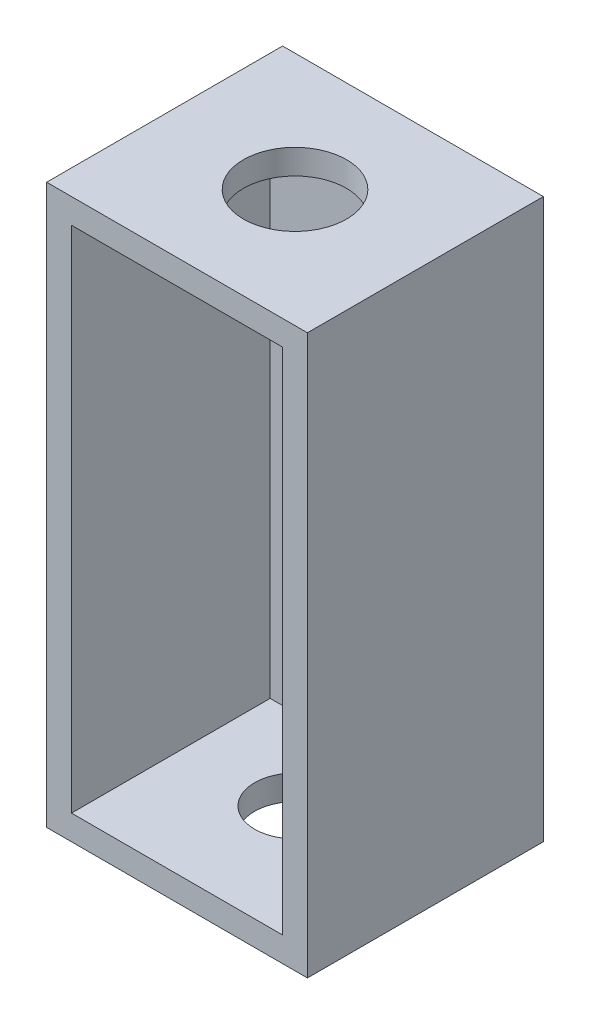
ISO-10303-21;
HEADER;
FILE_DESCRIPTION(('STEP AP214'),'2;1');
FILE_NAME('part.step','',(''),(''),'','','');
FILE_SCHEMA(('AUTOMOTIVE_DESIGN { 1 0 10303 214 1 1 1 1 }'));
ENDSEC;
DATA;
#1=APPLICATION_CONTEXT('core data for automotive mechanical design processes');
#2=APPLICATION_PROTOCOL_DEFINITION('international standard','automotive_design',2000,#1);
#3=PRODUCT_CONTEXT('',#1,'mechanical');
#4=PRODUCT('Part','Part','',(#3));
#5=PRODUCT_RELATED_PRODUCT_CATEGORY('part','',(#4));
#6=PRODUCT_DEFINITION_FORMATION('','',#4);
#7=PRODUCT_DEFINITION_CONTEXT('part definition',#1,'design');
#8=PRODUCT_DEFINITION('design','',#6,#7);
#9=PRODUCT_DEFINITION_SHAPE('','',#8);
#10=(LENGTH_UNIT() NAMED_UNIT(*) SI_UNIT(.MILLI.,.METRE.));
#11=(NAMED_UNIT(*) PLANE_ANGLE_UNIT() SI_UNIT($,.RADIAN.));
#12=(NAMED_UNIT(*) SI_UNIT($,.STERADIAN.) SOLID_ANGLE_UNIT());
#13=UNCERTAINTY_MEASURE_WITH_UNIT(LENGTH_MEASURE(1.E-05),#10,'distance_accuracy_value','');
#14=(GEOMETRIC_REPRESENTATION_CONTEXT(3) GLOBAL_UNCERTAINTY_ASSIGNED_CONTEXT((#13)) GLOBAL_UNIT_ASSIGNED_CONTEXT((#10,
#11,#12)) REPRESENTATION_CONTEXT('',''));
#15=CARTESIAN_POINT('',(0.,0.,0.));
#16=DIRECTION('',(0.,0.,1.));
#17=DIRECTION('',(1.,0.,0.));
#18=AXIS2_PLACEMENT_3D('',#15,#16,#17);
#19=CARTESIAN_POINT('',(0.,90.,38.));
#20=DIRECTION('',(1.,0.,0.));
#21=DIRECTION('',(0.,0.,-1.));
#22=AXIS2_PLACEMENT_3D('',#19,#20,#21);
#23=PLANE('',#22);
#24=DIRECTION('',(0.,-1.,0.));
#25=VECTOR('',#24,1.);
#26=CARTESIAN_POINT('',(0.,90.,0.));
#27=LINE('',#26,#25);
#28=CARTESIAN_POINT('',(0.,90.,0.));
#29=VERTEX_POINT('',#28);
#30=CARTESIAN_POINT('',(0.,0.,0.));
#31=VERTEX_POINT('',#30);
#32=EDGE_CURVE('E153',#29,#31,#27,.T.);
#33=ORIENTED_EDGE('',*,*,#32,.T.);
#34=DIRECTION('',(0.,0.,-1.));
#35=VECTOR('',#34,1.);
#36=CARTESIAN_POINT('',(0.,0.,38.));
#37=LINE('',#36,#35);
#38=CARTESIAN_POINT('',(0.,0.,38.));
#39=VERTEX_POINT('',#38);
#40=EDGE_CURVE('E11',#39,#31,#37,.T.);
#41=ORIENTED_EDGE('',*,*,#40,.F.);
#42=DIRECTION('',(0.,-1.,0.));
#43=VECTOR('',#42,1.);
#44=CARTESIAN_POINT('',(0.,90.,38.));
#45=LINE('',#44,#43);
#46=CARTESIAN_POINT('',(0.,90.,38.));
#47=VERTEX_POINT('',#46);
#48=EDGE_CURVE('E157',#47,#39,#45,.T.);
#49=ORIENTED_EDGE('',*,*,#48,.F.);
#50=DIRECTION('',(0.,0.,-1.));
#51=VECTOR('',#50,1.);
#52=CARTESIAN_POINT('',(0.,90.,38.));
#53=LINE('',#52,#51);
#54=EDGE_CURVE('E163',#47,#29,#53,.T.);
#55=ORIENTED_EDGE('',*,*,#54,.T.);
#56=EDGE_LOOP('',(#33,#41,#49,#55));
#57=FACE_BOUND('',#56,.T.);
#58=ADVANCED_FACE('F39',(#57),#23,.F.);
#59=CARTESIAN_POINT('',(0.,0.,38.));
#60=DIRECTION('',(0.,1.,0.));
#61=DIRECTION('',(0.,0.,1.));
#62=AXIS2_PLACEMENT_3D('',#59,#60,#61);
#63=PLANE('',#62);
#64=CARTESIAN_POINT('',(21.,0.,19.));
#65=DIRECTION('',(0.,1.,0.));
#66=DIRECTION('',(0.,0.,1.));
#67=AXIS2_PLACEMENT_3D('',#64,#65,#66);
#68=CIRCLE('',#67,6.5);
#69=CARTESIAN_POINT('',(21.,0.,25.5));
#70=VERTEX_POINT('',#69);
#71=EDGE_CURVE('E140',#70,#70,#68,.T.);
#72=ORIENTED_EDGE('',*,*,#71,.T.);
#73=EDGE_LOOP('',(#72));
#74=FACE_BOUND('',#73,.T.);
#75=DIRECTION('',(1.,0.,0.));
#76=VECTOR('',#75,1.);
#77=CARTESIAN_POINT('',(0.,0.,0.));
#78=LINE('',#77,#76);
#79=CARTESIAN_POINT('',(42.,0.,0.));
#80=VERTEX_POINT('',#79);
#81=EDGE_CURVE('E166',#31,#80,#78,.T.);
#82=ORIENTED_EDGE('',*,*,#81,.T.);
#83=DIRECTION('',(0.,0.,-1.));
#84=VECTOR('',#83,1.);
#85=CARTESIAN_POINT('',(42.,0.,38.));
#86=LINE('',#85,#84);
#87=CARTESIAN_POINT('',(42.,0.,38.));
#88=VERTEX_POINT('',#87);
#89=EDGE_CURVE('E47',#88,#80,#86,.T.);
#90=ORIENTED_EDGE('',*,*,#89,.F.);
#91=DIRECTION('',(1.,0.,0.));
#92=VECTOR('',#91,1.);
#93=CARTESIAN_POINT('',(0.,0.,38.));
#94=LINE('',#93,#92);
#95=EDGE_CURVE('E92',#39,#88,#94,.T.);
#96=ORIENTED_EDGE('',*,*,#95,.F.);
#97=ORIENTED_EDGE('',*,*,#40,.T.);
#98=EDGE_LOOP('',(#82,#90,#96,#97));
#99=FACE_BOUND('',#98,.T.);
#100=ADVANCED_FACE('F203',(#74,#99),#63,.F.);
#101=CARTESIAN_POINT('',(42.,0.,38.));
#102=DIRECTION('',(-1.,0.,0.));
#103=DIRECTION('',(0.,0.,1.));
#104=AXIS2_PLACEMENT_3D('',#101,#102,#103);
#105=PLANE('',#104);
#106=DIRECTION('',(0.,1.,0.));
#107=VECTOR('',#106,1.);
#108=CARTESIAN_POINT('',(42.,0.,0.));
#109=LINE('',#108,#107);
#110=CARTESIAN_POINT('',(42.,90.,0.));
#111=VERTEX_POINT('',#110);
#112=EDGE_CURVE('E168',#80,#111,#109,.T.);
#113=ORIENTED_EDGE('',*,*,#112,.T.);
#114=DIRECTION('',(0.,0.,-1.));
#115=VECTOR('',#114,1.);
#116=CARTESIAN_POINT('',(42.,90.,38.));
#117=LINE('',#116,#115);
#118=CARTESIAN_POINT('',(42.,90.,38.));
#119=VERTEX_POINT('',#118);
#120=EDGE_CURVE('E172',#119,#111,#117,.T.);
#121=ORIENTED_EDGE('',*,*,#120,.F.);
#122=DIRECTION('',(0.,1.,0.));
#123=VECTOR('',#122,1.);
#124=CARTESIAN_POINT('',(42.,0.,38.));
#125=LINE('',#124,#123);
#126=EDGE_CURVE('E160',#88,#119,#125,.T.);
#127=ORIENTED_EDGE('',*,*,#126,.F.);
#128=ORIENTED_EDGE('',*,*,#89,.T.);
#129=EDGE_LOOP('',(#113,#121,#127,#128));
#130=FACE_BOUND('',#129,.T.);
#131=ADVANCED_FACE('F194',(#130),#105,.F.);
#132=CARTESIAN_POINT('',(42.,90.,38.));
#133=DIRECTION('',(0.,-1.,0.));
#134=DIRECTION('',(0.,0.,-1.));
#135=AXIS2_PLACEMENT_3D('',#132,#133,#134);
#136=PLANE('',#135);
#137=CARTESIAN_POINT('',(21.,90.,19.));
#138=DIRECTION('',(0.,1.,0.));
#139=DIRECTION('',(0.,0.,1.));
#140=AXIS2_PLACEMENT_3D('',#137,#138,#139);
#141=CIRCLE('',#140,8.3);
#142=CARTESIAN_POINT('',(21.,90.,27.3));
#143=VERTEX_POINT('',#142);
#144=EDGE_CURVE('E182',#143,#143,#141,.T.);
#145=ORIENTED_EDGE('',*,*,#144,.F.);
#146=EDGE_LOOP('',(#145));
#147=FACE_BOUND('',#146,.T.);
#148=DIRECTION('',(-1.,0.,0.));
#149=VECTOR('',#148,1.);
#150=CARTESIAN_POINT('',(42.,90.,0.));
#151=LINE('',#150,#149);
#152=EDGE_CURVE('E85',#111,#29,#151,.T.);
#153=ORIENTED_EDGE('',*,*,#152,.T.);
#154=ORIENTED_EDGE('',*,*,#54,.F.);
#155=DIRECTION('',(-1.,0.,0.));
#156=VECTOR('',#155,1.);
#157=CARTESIAN_POINT('',(42.,90.,38.));
#158=LINE('',#157,#156);
#159=EDGE_CURVE('E64',#119,#47,#158,.T.);
#160=ORIENTED_EDGE('',*,*,#159,.F.);
#161=ORIENTED_EDGE('',*,*,#120,.T.);
#162=EDGE_LOOP('',(#153,#154,#160,#161));
#163=FACE_BOUND('',#162,.T.);
#164=ADVANCED_FACE('F191',(#147,#163),#136,.F.);
#165=CARTESIAN_POINT('',(0.,0.,38.));
#166=DIRECTION('',(0.,0.,1.));
#167=DIRECTION('',(1.,0.,0.));
#168=AXIS2_PLACEMENT_3D('',#165,#166,#167);
#169=PLANE('',#168);
#170=DIRECTION('',(0.,-1.,0.));
#171=VECTOR('',#170,1.);
#172=CARTESIAN_POINT('',(4.,86.,38.));
#173=LINE('',#172,#171);
#174=CARTESIAN_POINT('',(4.,86.,38.));
#175=VERTEX_POINT('',#174);
#176=CARTESIAN_POINT('',(4.,4.,38.));
#177=VERTEX_POINT('',#176);
#178=EDGE_CURVE('E55',#175,#177,#173,.T.);
#179=ORIENTED_EDGE('',*,*,#178,.F.);
#180=DIRECTION('',(-1.,0.,0.));
#181=VECTOR('',#180,1.);
#182=CARTESIAN_POINT('',(38.,86.,38.));
#183=LINE('',#182,#181);
#184=CARTESIAN_POINT('',(38.,86.,38.));
#185=VERTEX_POINT('',#184);
#186=EDGE_CURVE('E134',#185,#175,#183,.T.);
#187=ORIENTED_EDGE('',*,*,#186,.F.);
#188=DIRECTION('',(0.,1.,0.));
#189=VECTOR('',#188,1.);
#190=CARTESIAN_POINT('',(38.,4.,38.));
#191=LINE('',#190,#189);
#192=CARTESIAN_POINT('',(38.,4.,38.));
#193=VERTEX_POINT('',#192);
#194=EDGE_CURVE('E137',#193,#185,#191,.T.);
#195=ORIENTED_EDGE('',*,*,#194,.F.);
#196=DIRECTION('',(1.,0.,0.));
#197=VECTOR('',#196,1.);
#198=CARTESIAN_POINT('',(4.,4.,38.));
#199=LINE('',#198,#197);
#200=EDGE_CURVE('E146',#177,#193,#199,.T.);
#201=ORIENTED_EDGE('',*,*,#200,.F.);
#202=EDGE_LOOP('',(#179,#187,#195,#201));
#203=FACE_BOUND('',#202,.T.);
#204=ORIENTED_EDGE('',*,*,#48,.T.);
#205=ORIENTED_EDGE('',*,*,#95,.T.);
#206=ORIENTED_EDGE('',*,*,#126,.T.);
#207=ORIENTED_EDGE('',*,*,#159,.T.);
#208=EDGE_LOOP('',(#204,#205,#206,#207));
#209=FACE_BOUND('',#208,.T.);
#210=ADVANCED_FACE('F193',(#203,#209),#169,.T.);
#211=CARTESIAN_POINT('',(0.,0.,0.));
#212=DIRECTION('',(0.,0.,1.));
#213=DIRECTION('',(1.,0.,0.));
#214=AXIS2_PLACEMENT_3D('',#211,#212,#213);
#215=PLANE('',#214);
#216=ORIENTED_EDGE('',*,*,#32,.F.);
#217=ORIENTED_EDGE('',*,*,#152,.F.);
#218=ORIENTED_EDGE('',*,*,#112,.F.);
#219=ORIENTED_EDGE('',*,*,#81,.F.);
#220=EDGE_LOOP('',(#216,#217,#218,#219));
#221=FACE_BOUND('',#220,.T.);
#222=ADVANCED_FACE('F200',(#221),#215,.F.);
#223=CARTESIAN_POINT('',(4.,86.,6.));
#224=DIRECTION('',(-1.,0.,0.));
#225=DIRECTION('',(0.,0.,1.));
#226=AXIS2_PLACEMENT_3D('',#223,#224,#225);
#227=PLANE('',#226);
#228=ORIENTED_EDGE('',*,*,#178,.T.);
#229=DIRECTION('',(0.,0.,1.));
#230=VECTOR('',#229,1.);
#231=CARTESIAN_POINT('',(4.,4.,6.));
#232=LINE('',#231,#230);
#233=CARTESIAN_POINT('',(4.,4.,6.));
#234=VERTEX_POINT('',#233);
#235=EDGE_CURVE('E112',#234,#177,#232,.T.);
#236=ORIENTED_EDGE('',*,*,#235,.F.);
#237=DIRECTION('',(0.,-1.,0.));
#238=VECTOR('',#237,1.);
#239=CARTESIAN_POINT('',(4.,86.,6.));
#240=LINE('',#239,#238);
#241=CARTESIAN_POINT('',(4.,86.,6.));
#242=VERTEX_POINT('',#241);
#243=EDGE_CURVE('E116',#242,#234,#240,.T.);
#244=ORIENTED_EDGE('',*,*,#243,.F.);
#245=DIRECTION('',(0.,0.,1.));
#246=VECTOR('',#245,1.);
#247=CARTESIAN_POINT('',(4.,86.,6.));
#248=LINE('',#247,#246);
#249=EDGE_CURVE('E151',#242,#175,#248,.T.);
#250=ORIENTED_EDGE('',*,*,#249,.T.);
#251=EDGE_LOOP('',(#228,#236,#244,#250));
#252=FACE_BOUND('',#251,.T.);
#253=ADVANCED_FACE('F114',(#252),#227,.F.);
#254=CARTESIAN_POINT('',(38.,86.,6.));
#255=DIRECTION('',(0.,1.,0.));
#256=DIRECTION('',(0.,0.,1.));
#257=AXIS2_PLACEMENT_3D('',#254,#255,#256);
#258=PLANE('',#257);
#259=CARTESIAN_POINT('',(21.,86.,19.));
#260=DIRECTION('',(0.,1.,0.));
#261=DIRECTION('',(0.,0.,1.));
#262=AXIS2_PLACEMENT_3D('',#259,#260,#261);
#263=CIRCLE('',#262,8.3);
#264=CARTESIAN_POINT('',(21.,86.,27.3));
#265=VERTEX_POINT('',#264);
#266=EDGE_CURVE('E42',#265,#265,#263,.T.);
#267=ORIENTED_EDGE('',*,*,#266,.T.);
#268=EDGE_LOOP('',(#267));
#269=FACE_BOUND('',#268,.T.);
#270=ORIENTED_EDGE('',*,*,#186,.T.);
#271=ORIENTED_EDGE('',*,*,#249,.F.);
#272=DIRECTION('',(-1.,0.,0.));
#273=VECTOR('',#272,1.);
#274=CARTESIAN_POINT('',(38.,86.,6.));
#275=LINE('',#274,#273);
#276=CARTESIAN_POINT('',(38.,86.,6.));
#277=VERTEX_POINT('',#276);
#278=EDGE_CURVE('E122',#277,#242,#275,.T.);
#279=ORIENTED_EDGE('',*,*,#278,.F.);
#280=DIRECTION('',(0.,0.,1.));
#281=VECTOR('',#280,1.);
#282=CARTESIAN_POINT('',(38.,86.,6.));
#283=LINE('',#282,#281);
#284=EDGE_CURVE('E154',#277,#185,#283,.T.);
#285=ORIENTED_EDGE('',*,*,#284,.T.);
#286=EDGE_LOOP('',(#270,#271,#279,#285));
#287=FACE_BOUND('',#286,.T.);
#288=ADVANCED_FACE('F223',(#269,#287),#258,.F.);
#289=CARTESIAN_POINT('',(38.,4.,6.));
#290=DIRECTION('',(1.,0.,0.));
#291=DIRECTION('',(0.,0.,-1.));
#292=AXIS2_PLACEMENT_3D('',#289,#290,#291);
#293=PLANE('',#292);
#294=ORIENTED_EDGE('',*,*,#194,.T.);
#295=ORIENTED_EDGE('',*,*,#284,.F.);
#296=DIRECTION('',(0.,1.,0.));
#297=VECTOR('',#296,1.);
#298=CARTESIAN_POINT('',(38.,4.,6.));
#299=LINE('',#298,#297);
#300=CARTESIAN_POINT('',(38.,4.,6.));
#301=VERTEX_POINT('',#300);
#302=EDGE_CURVE('E130',#301,#277,#299,.T.);
#303=ORIENTED_EDGE('',*,*,#302,.F.);
#304=DIRECTION('',(0.,0.,1.));
#305=VECTOR('',#304,1.);
#306=CARTESIAN_POINT('',(38.,4.,6.));
#307=LINE('',#306,#305);
#308=EDGE_CURVE('E121',#301,#193,#307,.T.);
#309=ORIENTED_EDGE('',*,*,#308,.T.);
#310=EDGE_LOOP('',(#294,#295,#303,#309));
#311=FACE_BOUND('',#310,.T.);
#312=ADVANCED_FACE('F228',(#311),#293,.F.);
#313=CARTESIAN_POINT('',(4.,4.,6.));
#314=DIRECTION('',(0.,-1.,0.));
#315=DIRECTION('',(0.,0.,-1.));
#316=AXIS2_PLACEMENT_3D('',#313,#314,#315);
#317=PLANE('',#316);
#318=CARTESIAN_POINT('',(21.,4.,19.));
#319=DIRECTION('',(0.,-1.,0.));
#320=DIRECTION('',(0.,0.,-1.));
#321=AXIS2_PLACEMENT_3D('',#318,#319,#320);
#322=CIRCLE('',#321,6.5);
#323=CARTESIAN_POINT('',(21.,4.,25.5));
#324=VERTEX_POINT('',#323);
#325=EDGE_CURVE('E147',#324,#324,#322,.T.);
#326=ORIENTED_EDGE('',*,*,#325,.T.);
#327=EDGE_LOOP('',(#326));
#328=FACE_BOUND('',#327,.T.);
#329=ORIENTED_EDGE('',*,*,#200,.T.);
#330=ORIENTED_EDGE('',*,*,#308,.F.);
#331=DIRECTION('',(1.,0.,0.));
#332=VECTOR('',#331,1.);
#333=CARTESIAN_POINT('',(4.,4.,6.));
#334=LINE('',#333,#332);
#335=EDGE_CURVE('E125',#234,#301,#334,.T.);
#336=ORIENTED_EDGE('',*,*,#335,.F.);
#337=ORIENTED_EDGE('',*,*,#235,.T.);
#338=EDGE_LOOP('',(#329,#330,#336,#337));
#339=FACE_BOUND('',#338,.T.);
#340=ADVANCED_FACE('F126',(#328,#339),#317,.F.);
#341=CARTESIAN_POINT('',(0.,0.,6.));
#342=DIRECTION('',(0.,0.,1.));
#343=DIRECTION('',(1.,0.,0.));
#344=AXIS2_PLACEMENT_3D('',#341,#342,#343);
#345=PLANE('',#344);
#346=ORIENTED_EDGE('',*,*,#243,.T.);
#347=ORIENTED_EDGE('',*,*,#335,.T.);
#348=ORIENTED_EDGE('',*,*,#302,.T.);
#349=ORIENTED_EDGE('',*,*,#278,.T.);
#350=EDGE_LOOP('',(#346,#347,#348,#349));
#351=FACE_BOUND('',#350,.T.);
#352=ADVANCED_FACE('F132',(#351),#345,.T.);
#353=CARTESIAN_POINT('',(21.,0.,19.));
#354=DIRECTION('',(0.,1.,0.));
#355=DIRECTION('',(0.,0.,1.));
#356=AXIS2_PLACEMENT_3D('',#353,#354,#355);
#357=CYLINDRICAL_SURFACE('',#356,6.5);
#358=CARTESIAN_POINT('',(21.,0.,25.5));
#359=CARTESIAN_POINT('',(21.,0.0416666666666667,25.5));
#360=CARTESIAN_POINT('',(21.,0.0833333333333333,25.5));
#361=CARTESIAN_POINT('',(21.,0.166666666666667,25.5));
#362=CARTESIAN_POINT('',(21.,0.208333333333333,25.5));
#363=CARTESIAN_POINT('',(21.,0.291666666666667,25.5));
#364=CARTESIAN_POINT('',(21.,0.333333333333333,25.5));
#365=CARTESIAN_POINT('',(21.,0.416666666666667,25.5));
#366=CARTESIAN_POINT('',(21.,0.458333333333333,25.5));
#367=CARTESIAN_POINT('',(21.,0.541666666666667,25.5));
#368=CARTESIAN_POINT('',(21.,0.583333333333333,25.5));
#369=CARTESIAN_POINT('',(21.,0.666666666666667,25.5));
#370=CARTESIAN_POINT('',(21.,0.708333333333334,25.5));
#371=CARTESIAN_POINT('',(21.,0.791666666666667,25.5));
#372=CARTESIAN_POINT('',(21.,0.833333333333334,25.5));
#373=CARTESIAN_POINT('',(21.,0.916666666666667,25.5));
#374=CARTESIAN_POINT('',(21.,0.958333333333334,25.5));
#375=CARTESIAN_POINT('',(21.,1.04166666666667,25.5));
#376=CARTESIAN_POINT('',(21.,1.08333333333333,25.5));
#377=CARTESIAN_POINT('',(21.,1.16666666666667,25.5));
#378=CARTESIAN_POINT('',(21.,1.20833333333333,25.5));
#379=CARTESIAN_POINT('',(21.,1.29166666666667,25.5));
#380=CARTESIAN_POINT('',(21.,1.33333333333333,25.5));
#381=CARTESIAN_POINT('',(21.,1.41666666666667,25.5));
#382=CARTESIAN_POINT('',(21.,1.45833333333333,25.5));
#383=CARTESIAN_POINT('',(21.,1.54166666666667,25.5));
#384=CARTESIAN_POINT('',(21.,1.58333333333333,25.5));
#385=CARTESIAN_POINT('',(21.,1.66666666666667,25.5));
#386=CARTESIAN_POINT('',(21.,1.70833333333333,25.5));
#387=CARTESIAN_POINT('',(21.,1.79166666666667,25.5));
#388=CARTESIAN_POINT('',(21.,1.83333333333333,25.5));
#389=CARTESIAN_POINT('',(21.,1.91666666666667,25.5));
#390=CARTESIAN_POINT('',(21.,1.95833333333333,25.5));
#391=CARTESIAN_POINT('',(21.,2.04166666666667,25.5));
#392=CARTESIAN_POINT('',(21.,2.08333333333333,25.5));
#393=CARTESIAN_POINT('',(21.,2.16666666666667,25.5));
#394=CARTESIAN_POINT('',(21.,2.20833333333333,25.5));
#395=CARTESIAN_POINT('',(21.,2.29166666666667,25.5));
#396=CARTESIAN_POINT('',(21.,2.33333333333333,25.5));
#397=CARTESIAN_POINT('',(21.,2.41666666666667,25.5));
#398=CARTESIAN_POINT('',(21.,2.45833333333333,25.5));
#399=CARTESIAN_POINT('',(21.,2.54166666666667,25.5));
#400=CARTESIAN_POINT('',(21.,2.58333333333333,25.5));
#401=CARTESIAN_POINT('',(21.,2.66666666666667,25.5));
#402=CARTESIAN_POINT('',(21.,2.70833333333333,25.5));
#403=CARTESIAN_POINT('',(21.,2.79166666666667,25.5));
#404=CARTESIAN_POINT('',(21.,2.83333333333333,25.5));
#405=CARTESIAN_POINT('',(21.,2.91666666666667,25.5));
#406=CARTESIAN_POINT('',(21.,2.95833333333333,25.5));
#407=CARTESIAN_POINT('',(21.,3.04166666666667,25.5));
#408=CARTESIAN_POINT('',(21.,3.08333333333333,25.5));
#409=CARTESIAN_POINT('',(21.,3.16666666666667,25.5));
#410=CARTESIAN_POINT('',(21.,3.20833333333333,25.5));
#411=CARTESIAN_POINT('',(21.,3.29166666666667,25.5));
#412=CARTESIAN_POINT('',(21.,3.33333333333333,25.5));
#413=CARTESIAN_POINT('',(21.,3.41666666666667,25.5));
#414=CARTESIAN_POINT('',(21.,3.45833333333333,25.5));
#415=CARTESIAN_POINT('',(21.,3.54166666666667,25.5));
#416=CARTESIAN_POINT('',(21.,3.58333333333333,25.5));
#417=CARTESIAN_POINT('',(21.,3.66666666666667,25.5));
#418=CARTESIAN_POINT('',(21.,3.70833333333333,25.5));
#419=CARTESIAN_POINT('',(21.,3.79166666666667,25.5));
#420=CARTESIAN_POINT('',(21.,3.83333333333333,25.5));
#421=CARTESIAN_POINT('',(21.,3.91666666666667,25.5));
#422=CARTESIAN_POINT('',(21.,3.95833333333333,25.5));
#423=CARTESIAN_POINT('',(21.,4.,25.5));
#424=B_SPLINE_CURVE_WITH_KNOTS('',3,(#358,#359,#360,#361,#362,#363,#364,#365,#366,#367,#368,
#369,#370,#371,#372,#373,#374,#375,#376,#377,#378,#379,#380,#381,#382,#383,#384,#385,#386,#387,
#388,#389,#390,#391,#392,#393,#394,#395,#396,#397,#398,#399,#400,#401,#402,#403,#404,#405,#406,
#407,#408,#409,#410,#411,#412,#413,#414,#415,#416,#417,#418,#419,#420,#421,#422,#423),
.UNSPECIFIED.,.F.,.F.,(4,2,2,2,2,2,2,2,2,2,2,2,2,2,2,2,2,2,2,2,2,2,2,2,2,2,2,2,2,2,2,2,4),(0.,
0.125,0.25,0.375,0.5,0.625,0.75,0.875,1.,1.125,1.25,1.375,1.5,1.625,1.75,1.875,2.,2.125,2.25,
2.375,2.5,2.625,2.75,2.875,3.,3.125,3.25,3.375,3.5,3.625,3.75,3.875,4.),.UNSPECIFIED.);
#425=EDGE_CURVE('BSEAM236',#70,#324,#424,.T.);
#426=ORIENTED_EDGE('',*,*,#71,.F.);
#427=ORIENTED_EDGE('',*,*,#325,.F.);
#428=ORIENTED_EDGE('',*,*,#425,.T.);
#429=ORIENTED_EDGE('',*,*,#425,.F.);
#430=EDGE_LOOP('',(#426,#428,#427,#429));
#431=FACE_BOUND('',#430,.T.);
#432=ADVANCED_FACE('F236',(#431),#357,.F.);
#433=CARTESIAN_POINT('',(21.,85.7,19.));
#434=DIRECTION('',(0.,1.,0.));
#435=DIRECTION('',(0.,0.,1.));
#436=AXIS2_PLACEMENT_3D('',#433,#434,#435);
#437=CYLINDRICAL_SURFACE('',#436,8.3);
#438=CARTESIAN_POINT('',(21.,90.,27.3));
#439=CARTESIAN_POINT('',(21.,89.9583333333333,27.3));
#440=CARTESIAN_POINT('',(21.,89.9166666666666,27.3));
#441=CARTESIAN_POINT('',(21.,89.8333333333333,27.3));
#442=CARTESIAN_POINT('',(21.,89.7916666666666,27.3));
#443=CARTESIAN_POINT('',(21.,89.7083333333333,27.3));
#444=CARTESIAN_POINT('',(21.,89.6666666666666,27.3));
#445=CARTESIAN_POINT('',(21.,89.5833333333333,27.3));
#446=CARTESIAN_POINT('',(21.,89.5416666666666,27.3));
#447=CARTESIAN_POINT('',(21.,89.4583333333333,27.3));
#448=CARTESIAN_POINT('',(21.,89.4166666666666,27.3));
#449=CARTESIAN_POINT('',(21.,89.3333333333333,27.3));
#450=CARTESIAN_POINT('',(21.,89.2916666666666,27.3));
#451=CARTESIAN_POINT('',(21.,89.2083333333333,27.3));
#452=CARTESIAN_POINT('',(21.,89.1666666666666,27.3));
#453=CARTESIAN_POINT('',(21.,89.0833333333333,27.3));
#454=CARTESIAN_POINT('',(21.,89.0416666666666,27.3));
#455=CARTESIAN_POINT('',(21.,88.9583333333333,27.3));
#456=CARTESIAN_POINT('',(21.,88.9166666666666,27.3));
#457=CARTESIAN_POINT('',(21.,88.8333333333333,27.3));
#458=CARTESIAN_POINT('',(21.,88.7916666666666,27.3));
#459=CARTESIAN_POINT('',(21.,88.7083333333333,27.3));
#460=CARTESIAN_POINT('',(21.,88.6666666666666,27.3));
#461=CARTESIAN_POINT('',(21.,88.5833333333333,27.3));
#462=CARTESIAN_POINT('',(21.,88.5416666666666,27.3));
#463=CARTESIAN_POINT('',(21.,88.4583333333333,27.3));
#464=CARTESIAN_POINT('',(21.,88.4166666666666,27.3));
#465=CARTESIAN_POINT('',(21.,88.3333333333333,27.3));
#466=CARTESIAN_POINT('',(21.,88.2916666666666,27.3));
#467=CARTESIAN_POINT('',(21.,88.2083333333333,27.3));
#468=CARTESIAN_POINT('',(21.,88.1666666666666,27.3));
#469=CARTESIAN_POINT('',(21.,88.0833333333333,27.3));
#470=CARTESIAN_POINT('',(21.,88.0416666666666,27.3));
#471=CARTESIAN_POINT('',(21.,87.9583333333333,27.3));
#472=CARTESIAN_POINT('',(21.,87.9166666666666,27.3));
#473=CARTESIAN_POINT('',(21.,87.8333333333333,27.3));
#474=CARTESIAN_POINT('',(21.,87.7916666666666,27.3));
#475=CARTESIAN_POINT('',(21.,87.7083333333333,27.3));
#476=CARTESIAN_POINT('',(21.,87.6666666666666,27.3));
#477=CARTESIAN_POINT('',(21.,87.5833333333333,27.3));
#478=CARTESIAN_POINT('',(21.,87.5416666666666,27.3));
#479=CARTESIAN_POINT('',(21.,87.4583333333333,27.3));
#480=CARTESIAN_POINT('',(21.,87.4166666666666,27.3));
#481=CARTESIAN_POINT('',(21.,87.3333333333333,27.3));
#482=CARTESIAN_POINT('',(21.,87.2916666666666,27.3));
#483=CARTESIAN_POINT('',(21.,87.2083333333333,27.3));
#484=CARTESIAN_POINT('',(21.,87.1666666666666,27.3));
#485=CARTESIAN_POINT('',(21.,87.0833333333333,27.3));
#486=CARTESIAN_POINT('',(21.,87.0416666666666,27.3));
#487=CARTESIAN_POINT('',(21.,86.9583333333333,27.3));
#488=CARTESIAN_POINT('',(21.,86.9166666666666,27.3));
#489=CARTESIAN_POINT('',(21.,86.8333333333333,27.3));
#490=CARTESIAN_POINT('',(21.,86.7916666666666,27.3));
#491=CARTESIAN_POINT('',(21.,86.7083333333333,27.3));
#492=CARTESIAN_POINT('',(21.,86.6666666666666,27.3));
#493=CARTESIAN_POINT('',(21.,86.5833333333333,27.3));
#494=CARTESIAN_POINT('',(21.,86.5416666666666,27.3));
#495=CARTESIAN_POINT('',(21.,86.4583333333333,27.3));
#496=CARTESIAN_POINT('',(21.,86.4166666666666,27.3));
#497=CARTESIAN_POINT('',(21.,86.3333333333333,27.3));
#498=CARTESIAN_POINT('',(21.,86.2916666666666,27.3));
#499=CARTESIAN_POINT('',(21.,86.2083333333333,27.3));
#500=CARTESIAN_POINT('',(21.,86.1666666666666,27.3));
#501=CARTESIAN_POINT('',(21.,86.0833333333333,27.3));
#502=CARTESIAN_POINT('',(21.,86.0416666666666,27.3));
#503=CARTESIAN_POINT('',(21.,86.,27.3));
#504=B_SPLINE_CURVE_WITH_KNOTS('',3,(#438,#439,#440,#441,#442,#443,#444,#445,#446,#447,#448,
#449,#450,#451,#452,#453,#454,#455,#456,#457,#458,#459,#460,#461,#462,#463,#464,#465,#466,#467,
#468,#469,#470,#471,#472,#473,#474,#475,#476,#477,#478,#479,#480,#481,#482,#483,#484,#485,#486,
#487,#488,#489,#490,#491,#492,#493,#494,#495,#496,#497,#498,#499,#500,#501,#502,#503),
.UNSPECIFIED.,.F.,.F.,(4,2,2,2,2,2,2,2,2,2,2,2,2,2,2,2,2,2,2,2,2,2,2,2,2,2,2,2,2,2,2,2,4),(0.,
0.125,0.25,0.375,0.5,0.625000000000001,0.750000000000001,0.875000000000001,1.,1.125,1.25,1.375,
1.5,1.625,1.75,1.875,2.,2.125,2.25,2.375,2.5,2.625,2.75,2.875,3.,3.125,3.25,3.375,3.5,3.625,
3.75,3.875,4.),.UNSPECIFIED.);
#505=EDGE_CURVE('BSEAM188',#143,#265,#504,.T.);
#506=ORIENTED_EDGE('',*,*,#144,.T.);
#507=ORIENTED_EDGE('',*,*,#266,.F.);
#508=ORIENTED_EDGE('',*,*,#505,.T.);
#509=ORIENTED_EDGE('',*,*,#505,.F.);
#510=EDGE_LOOP('',(#506,#508,#507,#509));
#511=FACE_BOUND('',#510,.T.);
#512=ADVANCED_FACE('F188',(#511),#437,.F.);
#513=CLOSED_SHELL('',(#58,#100,#131,#164,#210,#222,#253,#288,#312,#340,#352,#432,#512));
#514=MANIFOLD_SOLID_BREP('B2',#513);
#515=ADVANCED_BREP_SHAPE_REPRESENTATION('',(#18,#514),#14);
#516=SHAPE_DEFINITION_REPRESENTATION(#9,#515);
ENDSEC;
END-ISO-10303-21;
